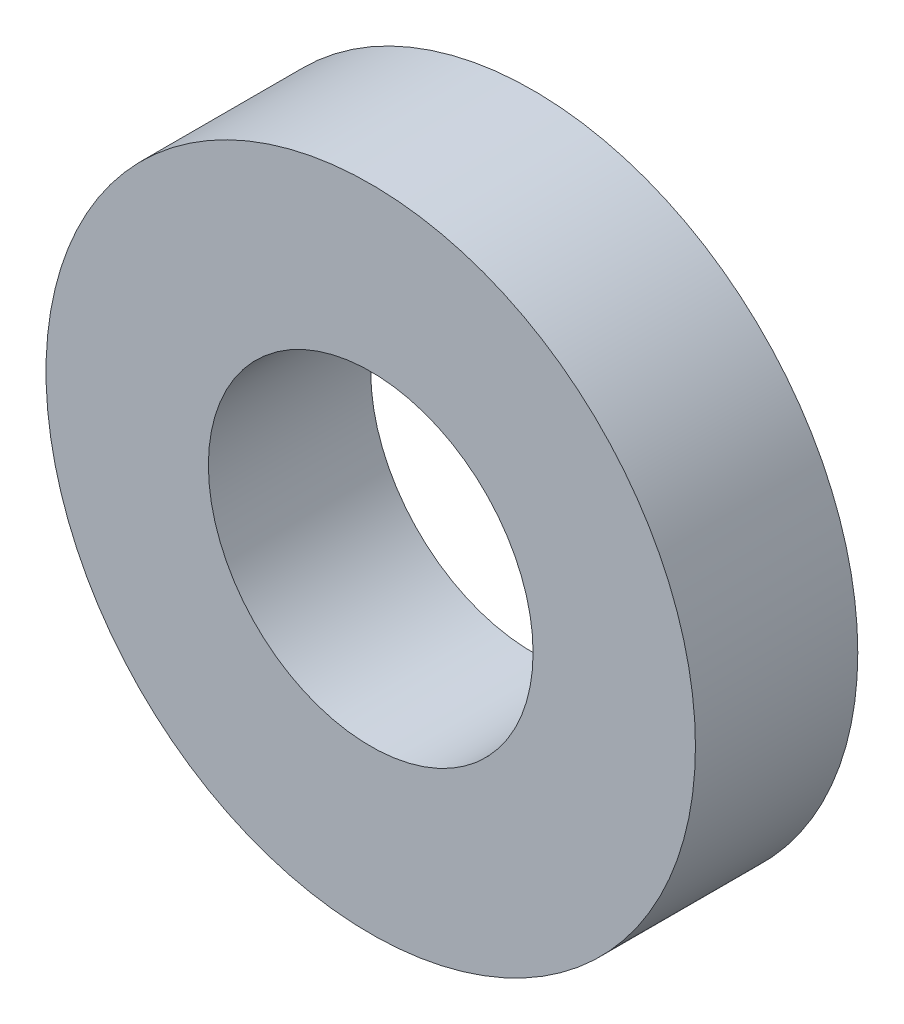
ISO-10303-21;
HEADER;
FILE_DESCRIPTION(('STEP AP214'),'2;1');
FILE_NAME('part.step','',(''),(''),'','','');
FILE_SCHEMA(('AUTOMOTIVE_DESIGN { 1 0 10303 214 1 1 1 1 }'));
ENDSEC;
DATA;
#1=APPLICATION_CONTEXT('core data for automotive mechanical design processes');
#2=APPLICATION_PROTOCOL_DEFINITION('international standard','automotive_design',2000,#1);
#3=PRODUCT_CONTEXT('',#1,'mechanical');
#4=PRODUCT('Part','Part','',(#3));
#5=PRODUCT_RELATED_PRODUCT_CATEGORY('part','',(#4));
#6=PRODUCT_DEFINITION_FORMATION('','',#4);
#7=PRODUCT_DEFINITION_CONTEXT('part definition',#1,'design');
#8=PRODUCT_DEFINITION('design','',#6,#7);
#9=PRODUCT_DEFINITION_SHAPE('','',#8);
#10=(LENGTH_UNIT() NAMED_UNIT(*) SI_UNIT(.MILLI.,.METRE.));
#11=(NAMED_UNIT(*) PLANE_ANGLE_UNIT() SI_UNIT($,.RADIAN.));
#12=(NAMED_UNIT(*) SI_UNIT($,.STERADIAN.) SOLID_ANGLE_UNIT());
#13=UNCERTAINTY_MEASURE_WITH_UNIT(LENGTH_MEASURE(1.E-05),#10,'distance_accuracy_value','');
#14=(GEOMETRIC_REPRESENTATION_CONTEXT(3) GLOBAL_UNCERTAINTY_ASSIGNED_CONTEXT((#13)) GLOBAL_UNIT_ASSIGNED_CONTEXT((#10,
#11,#12)) REPRESENTATION_CONTEXT('',''));
#15=CARTESIAN_POINT('',(0.,0.,0.));
#16=DIRECTION('',(0.,0.,1.));
#17=DIRECTION('',(1.,0.,0.));
#18=AXIS2_PLACEMENT_3D('',#15,#16,#17);
#19=CARTESIAN_POINT('',(0.,0.,1.));
#20=DIRECTION('',(0.,0.,1.));
#21=DIRECTION('',(1.,0.,0.));
#22=AXIS2_PLACEMENT_3D('',#19,#20,#21);
#23=PLANE('',#22);
#24=CARTESIAN_POINT('',(0.,0.,1.));
#25=DIRECTION('',(0.,0.,1.));
#26=DIRECTION('',(1.,0.,0.));
#27=AXIS2_PLACEMENT_3D('',#24,#25,#26);
#28=CIRCLE('',#27,2.);
#29=CARTESIAN_POINT('',(2.,0.,1.));
#30=VERTEX_POINT('',#29);
#31=EDGE_CURVE('E10',#30,#30,#28,.T.);
#32=ORIENTED_EDGE('',*,*,#31,.T.);
#33=EDGE_LOOP('',(#32));
#34=FACE_BOUND('',#33,.T.);
#35=CARTESIAN_POINT('',(0.,0.,1.));
#36=DIRECTION('',(0.,0.,1.));
#37=DIRECTION('',(1.,0.,0.));
#38=AXIS2_PLACEMENT_3D('',#35,#36,#37);
#39=CIRCLE('',#38,1.);
#40=CARTESIAN_POINT('',(1.,0.,1.));
#41=VERTEX_POINT('',#40);
#42=EDGE_CURVE('E41',#41,#41,#39,.T.);
#43=ORIENTED_EDGE('',*,*,#42,.F.);
#44=EDGE_LOOP('',(#43));
#45=FACE_BOUND('',#44,.T.);
#46=ADVANCED_FACE('F30',(#34,#45),#23,.T.);
#47=CARTESIAN_POINT('',(0.,0.,0.));
#48=DIRECTION('',(0.,0.,1.));
#49=DIRECTION('',(1.,0.,0.));
#50=AXIS2_PLACEMENT_3D('',#47,#48,#49);
#51=PLANE('',#50);
#52=CARTESIAN_POINT('',(0.,0.,0.));
#53=DIRECTION('',(0.,0.,1.));
#54=DIRECTION('',(1.,0.,0.));
#55=AXIS2_PLACEMENT_3D('',#52,#53,#54);
#56=CIRCLE('',#55,2.);
#57=CARTESIAN_POINT('',(2.,0.,0.));
#58=VERTEX_POINT('',#57);
#59=EDGE_CURVE('E34',#58,#58,#56,.T.);
#60=ORIENTED_EDGE('',*,*,#59,.F.);
#61=EDGE_LOOP('',(#60));
#62=FACE_BOUND('',#61,.T.);
#63=CARTESIAN_POINT('',(0.,0.,0.));
#64=DIRECTION('',(0.,0.,1.));
#65=DIRECTION('',(1.,0.,0.));
#66=AXIS2_PLACEMENT_3D('',#63,#64,#65);
#67=CIRCLE('',#66,1.);
#68=CARTESIAN_POINT('',(1.,0.,0.));
#69=VERTEX_POINT('',#68);
#70=EDGE_CURVE('E43',#69,#69,#67,.T.);
#71=ORIENTED_EDGE('',*,*,#70,.T.);
#72=EDGE_LOOP('',(#71));
#73=FACE_BOUND('',#72,.T.);
#74=ADVANCED_FACE('F53',(#62,#73),#51,.F.);
#75=CARTESIAN_POINT('',(0.,0.,1.));
#76=DIRECTION('',(0.,0.,-1.));
#77=DIRECTION('',(-1.,0.,0.));
#78=AXIS2_PLACEMENT_3D('',#75,#76,#77);
#79=CYLINDRICAL_SURFACE('',#78,2.);
#80=ORIENTED_EDGE('',*,*,#31,.F.);
#81=EDGE_LOOP('',(#80));
#82=FACE_BOUND('',#81,.T.);
#83=ORIENTED_EDGE('',*,*,#59,.T.);
#84=EDGE_LOOP('',(#83));
#85=FACE_BOUND('',#84,.T.);
#86=ADVANCED_FACE('F32',(#82,#85),#79,.T.);
#87=CARTESIAN_POINT('',(0.,0.,1.));
#88=DIRECTION('',(0.,0.,-1.));
#89=DIRECTION('',(-1.,0.,0.));
#90=AXIS2_PLACEMENT_3D('',#87,#88,#89);
#91=CYLINDRICAL_SURFACE('',#90,1.);
#92=ORIENTED_EDGE('',*,*,#42,.T.);
#93=EDGE_LOOP('',(#92));
#94=FACE_BOUND('',#93,.T.);
#95=ORIENTED_EDGE('',*,*,#70,.F.);
#96=EDGE_LOOP('',(#95));
#97=FACE_BOUND('',#96,.T.);
#98=ADVANCED_FACE('F49',(#94,#97),#91,.F.);
#99=CLOSED_SHELL('',(#46,#74,#86,#98));
#100=MANIFOLD_SOLID_BREP('B2',#99);
#101=ADVANCED_BREP_SHAPE_REPRESENTATION('',(#18,#100),#14);
#102=SHAPE_DEFINITION_REPRESENTATION(#9,#101);
ENDSEC;
END-ISO-10303-21;
